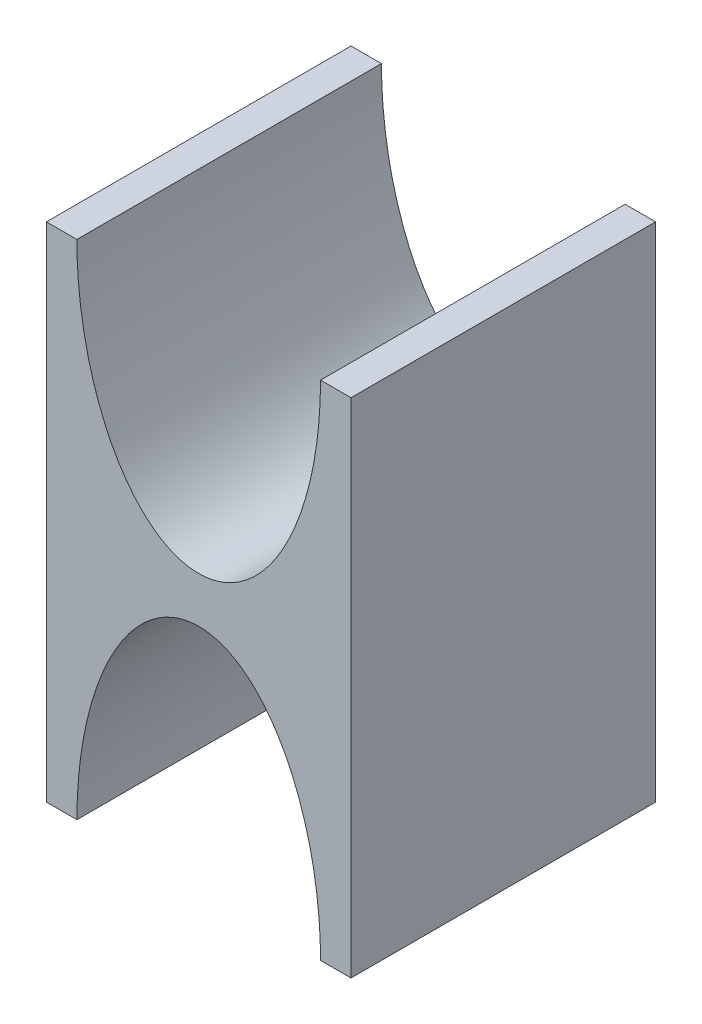
ISO-10303-21;
HEADER;
FILE_DESCRIPTION(('STEP AP214'),'2;1');
FILE_NAME('part.step','',(''),(''),'','','');
FILE_SCHEMA(('AUTOMOTIVE_DESIGN { 1 0 10303 214 1 1 1 1 }'));
ENDSEC;
DATA;
#1=APPLICATION_CONTEXT('core data for automotive mechanical design processes');
#2=APPLICATION_PROTOCOL_DEFINITION('international standard','automotive_design',2000,#1);
#3=PRODUCT_CONTEXT('',#1,'mechanical');
#4=PRODUCT('Part','Part','',(#3));
#5=PRODUCT_RELATED_PRODUCT_CATEGORY('part','',(#4));
#6=PRODUCT_DEFINITION_FORMATION('','',#4);
#7=PRODUCT_DEFINITION_CONTEXT('part definition',#1,'design');
#8=PRODUCT_DEFINITION('design','',#6,#7);
#9=PRODUCT_DEFINITION_SHAPE('','',#8);
#10=(LENGTH_UNIT() NAMED_UNIT(*) SI_UNIT(.MILLI.,.METRE.));
#11=(NAMED_UNIT(*) PLANE_ANGLE_UNIT() SI_UNIT($,.RADIAN.));
#12=(NAMED_UNIT(*) SI_UNIT($,.STERADIAN.) SOLID_ANGLE_UNIT());
#13=UNCERTAINTY_MEASURE_WITH_UNIT(LENGTH_MEASURE(1.E-05),#10,'distance_accuracy_value','');
#14=(GEOMETRIC_REPRESENTATION_CONTEXT(3) GLOBAL_UNCERTAINTY_ASSIGNED_CONTEXT((#13)) GLOBAL_UNIT_ASSIGNED_CONTEXT((#10,
#11,#12)) REPRESENTATION_CONTEXT('',''));
#15=CARTESIAN_POINT('',(0.,0.,0.));
#16=DIRECTION('',(0.,0.,1.));
#17=DIRECTION('',(1.,0.,0.));
#18=AXIS2_PLACEMENT_3D('',#15,#16,#17);
#19=CARTESIAN_POINT('',(-8.,-16.5,20.));
#20=DIRECTION('',(0.,1.,0.));
#21=DIRECTION('',(0.,0.,1.));
#22=AXIS2_PLACEMENT_3D('',#19,#20,#21);
#23=PLANE('',#22);
#24=DIRECTION('',(1.,0.,0.));
#25=VECTOR('',#24,1.);
#26=CARTESIAN_POINT('',(-8.,-16.5,0.));
#27=LINE('',#26,#25);
#28=CARTESIAN_POINT('',(-10.,-16.5,0.));
#29=VERTEX_POINT('',#28);
#30=CARTESIAN_POINT('',(-8.,-16.5,0.));
#31=VERTEX_POINT('',#30);
#32=EDGE_CURVE('E141',#29,#31,#27,.T.);
#33=ORIENTED_EDGE('',*,*,#32,.T.);
#34=DIRECTION('',(0.,0.,-1.));
#35=VECTOR('',#34,1.);
#36=CARTESIAN_POINT('',(-8.,-16.5,20.));
#37=LINE('',#36,#35);
#38=CARTESIAN_POINT('',(-8.,-16.5,20.));
#39=VERTEX_POINT('',#38);
#40=EDGE_CURVE('E12',#39,#31,#37,.T.);
#41=ORIENTED_EDGE('',*,*,#40,.F.);
#42=DIRECTION('',(1.,0.,0.));
#43=VECTOR('',#42,1.);
#44=CARTESIAN_POINT('',(-8.,-16.5,20.));
#45=LINE('',#44,#43);
#46=CARTESIAN_POINT('',(-10.,-16.5,20.));
#47=VERTEX_POINT('',#46);
#48=EDGE_CURVE('E156',#47,#39,#45,.T.);
#49=ORIENTED_EDGE('',*,*,#48,.F.);
#50=DIRECTION('',(0.,0.,-1.));
#51=VECTOR('',#50,1.);
#52=CARTESIAN_POINT('',(-10.,-16.5,20.));
#53=LINE('',#52,#51);
#54=EDGE_CURVE('E136',#47,#29,#53,.T.);
#55=ORIENTED_EDGE('',*,*,#54,.T.);
#56=EDGE_LOOP('',(#33,#41,#49,#55));
#57=FACE_BOUND('',#56,.T.);
#58=ADVANCED_FACE('F44',(#57),#23,.F.);
#59=CARTESIAN_POINT('',(0.,-16.5,20.));
#60=DIRECTION('',(0.,0.,-1.));
#61=DIRECTION('',(0.,1.,0.));
#62=AXIS2_PLACEMENT_3D('',#59,#60,#61);
#63=ELLIPSE('',#62,15.,8.);
#64=DIRECTION('',(0.,0.,-1.));
#65=VECTOR('',#64,1.);
#66=SURFACE_OF_LINEAR_EXTRUSION('',#63,#65);
#67=CARTESIAN_POINT('',(0.,-16.5,0.));
#68=DIRECTION('',(0.,0.,-1.));
#69=DIRECTION('',(0.,1.,0.));
#70=AXIS2_PLACEMENT_3D('',#67,#68,#69);
#71=ELLIPSE('',#70,15.,8.);
#72=CARTESIAN_POINT('',(8.,-16.5,0.));
#73=VERTEX_POINT('',#72);
#74=EDGE_CURVE('E144',#31,#73,#71,.T.);
#75=ORIENTED_EDGE('',*,*,#74,.T.);
#76=DIRECTION('',(0.,0.,-1.));
#77=VECTOR('',#76,1.);
#78=CARTESIAN_POINT('',(8.,-16.5,20.));
#79=LINE('',#78,#77);
#80=CARTESIAN_POINT('',(8.,-16.5,20.));
#81=VERTEX_POINT('',#80);
#82=EDGE_CURVE('E52',#81,#73,#79,.T.);
#83=ORIENTED_EDGE('',*,*,#82,.F.);
#84=EDGE_CURVE('E103',#39,#81,#63,.T.);
#85=ORIENTED_EDGE('',*,*,#84,.F.);
#86=ORIENTED_EDGE('',*,*,#40,.T.);
#87=EDGE_LOOP('',(#75,#83,#85,#86));
#88=FACE_BOUND('',#87,.T.);
#89=ADVANCED_FACE('F191',(#88),#66,.F.);
#90=CARTESIAN_POINT('',(8.,-16.5,20.));
#91=DIRECTION('',(0.,1.,0.));
#92=DIRECTION('',(0.,0.,1.));
#93=AXIS2_PLACEMENT_3D('',#90,#91,#92);
#94=PLANE('',#93);
#95=DIRECTION('',(1.,0.,0.));
#96=VECTOR('',#95,1.);
#97=CARTESIAN_POINT('',(8.,-16.5,0.));
#98=LINE('',#97,#96);
#99=CARTESIAN_POINT('',(10.,-16.5,0.));
#100=VERTEX_POINT('',#99);
#101=EDGE_CURVE('E146',#73,#100,#98,.T.);
#102=ORIENTED_EDGE('',*,*,#101,.T.);
#103=DIRECTION('',(0.,0.,-1.));
#104=VECTOR('',#103,1.);
#105=CARTESIAN_POINT('',(10.,-16.5,20.));
#106=LINE('',#105,#104);
#107=CARTESIAN_POINT('',(10.,-16.5,20.));
#108=VERTEX_POINT('',#107);
#109=EDGE_CURVE('E165',#108,#100,#106,.T.);
#110=ORIENTED_EDGE('',*,*,#109,.F.);
#111=DIRECTION('',(1.,0.,0.));
#112=VECTOR('',#111,1.);
#113=CARTESIAN_POINT('',(8.,-16.5,20.));
#114=LINE('',#113,#112);
#115=EDGE_CURVE('E173',#81,#108,#114,.T.);
#116=ORIENTED_EDGE('',*,*,#115,.F.);
#117=ORIENTED_EDGE('',*,*,#82,.T.);
#118=EDGE_LOOP('',(#102,#110,#116,#117));
#119=FACE_BOUND('',#118,.T.);
#120=ADVANCED_FACE('F171',(#119),#94,.F.);
#121=CARTESIAN_POINT('',(10.,16.5,20.));
#122=DIRECTION('',(-1.,0.,0.));
#123=DIRECTION('',(0.,-1.,0.));
#124=AXIS2_PLACEMENT_3D('',#121,#122,#123);
#125=PLANE('',#124);
#126=DIRECTION('',(0.,1.,0.));
#127=VECTOR('',#126,1.);
#128=CARTESIAN_POINT('',(10.,16.5,0.));
#129=LINE('',#128,#127);
#130=CARTESIAN_POINT('',(10.,16.5,0.));
#131=VERTEX_POINT('',#130);
#132=EDGE_CURVE('E147',#100,#131,#129,.T.);
#133=ORIENTED_EDGE('',*,*,#132,.T.);
#134=DIRECTION('',(0.,0.,-1.));
#135=VECTOR('',#134,1.);
#136=CARTESIAN_POINT('',(10.,16.5,20.));
#137=LINE('',#136,#135);
#138=CARTESIAN_POINT('',(10.,16.5,20.));
#139=VERTEX_POINT('',#138);
#140=EDGE_CURVE('E162',#139,#131,#137,.T.);
#141=ORIENTED_EDGE('',*,*,#140,.F.);
#142=DIRECTION('',(0.,1.,0.));
#143=VECTOR('',#142,1.);
#144=CARTESIAN_POINT('',(10.,16.5,20.));
#145=LINE('',#144,#143);
#146=EDGE_CURVE('E185',#108,#139,#145,.T.);
#147=ORIENTED_EDGE('',*,*,#146,.F.);
#148=ORIENTED_EDGE('',*,*,#109,.T.);
#149=EDGE_LOOP('',(#133,#141,#147,#148));
#150=FACE_BOUND('',#149,.T.);
#151=ADVANCED_FACE('F181',(#150),#125,.F.);
#152=CARTESIAN_POINT('',(8.,16.5,20.));
#153=DIRECTION('',(0.,-1.,0.));
#154=DIRECTION('',(0.,0.,-1.));
#155=AXIS2_PLACEMENT_3D('',#152,#153,#154);
#156=PLANE('',#155);
#157=DIRECTION('',(-1.,0.,0.));
#158=VECTOR('',#157,1.);
#159=CARTESIAN_POINT('',(8.,16.5,0.));
#160=LINE('',#159,#158);
#161=CARTESIAN_POINT('',(8.,16.5,0.));
#162=VERTEX_POINT('',#161);
#163=EDGE_CURVE('E151',#131,#162,#160,.T.);
#164=ORIENTED_EDGE('',*,*,#163,.T.);
#165=DIRECTION('',(0.,0.,-1.));
#166=VECTOR('',#165,1.);
#167=CARTESIAN_POINT('',(8.,16.5,20.));
#168=LINE('',#167,#166);
#169=CARTESIAN_POINT('',(8.,16.5,20.));
#170=VERTEX_POINT('',#169);
#171=EDGE_CURVE('E131',#170,#162,#168,.T.);
#172=ORIENTED_EDGE('',*,*,#171,.F.);
#173=DIRECTION('',(-1.,0.,0.));
#174=VECTOR('',#173,1.);
#175=CARTESIAN_POINT('',(8.,16.5,20.));
#176=LINE('',#175,#174);
#177=EDGE_CURVE('E122',#139,#170,#176,.T.);
#178=ORIENTED_EDGE('',*,*,#177,.F.);
#179=ORIENTED_EDGE('',*,*,#140,.T.);
#180=EDGE_LOOP('',(#164,#172,#178,#179));
#181=FACE_BOUND('',#180,.T.);
#182=ADVANCED_FACE('F184',(#181),#156,.F.);
#183=CARTESIAN_POINT('',(0.,16.5,20.));
#184=DIRECTION('',(0.,0.,-1.));
#185=DIRECTION('',(0.,-1.,0.));
#186=AXIS2_PLACEMENT_3D('',#183,#184,#185);
#187=ELLIPSE('',#186,15.,8.);
#188=DIRECTION('',(0.,0.,-1.));
#189=VECTOR('',#188,1.);
#190=SURFACE_OF_LINEAR_EXTRUSION('',#187,#189);
#191=CARTESIAN_POINT('',(0.,16.5,0.));
#192=DIRECTION('',(0.,0.,-1.));
#193=DIRECTION('',(0.,-1.,0.));
#194=AXIS2_PLACEMENT_3D('',#191,#192,#193);
#195=ELLIPSE('',#194,15.,8.);
#196=CARTESIAN_POINT('',(-8.,16.5,0.));
#197=VERTEX_POINT('',#196);
#198=EDGE_CURVE('E130',#162,#197,#195,.T.);
#199=ORIENTED_EDGE('',*,*,#198,.T.);
#200=DIRECTION('',(0.,0.,-1.));
#201=VECTOR('',#200,1.);
#202=CARTESIAN_POINT('',(-8.,16.5,20.));
#203=LINE('',#202,#201);
#204=CARTESIAN_POINT('',(-8.,16.5,20.));
#205=VERTEX_POINT('',#204);
#206=EDGE_CURVE('E127',#205,#197,#203,.T.);
#207=ORIENTED_EDGE('',*,*,#206,.F.);
#208=EDGE_CURVE('E116',#170,#205,#187,.T.);
#209=ORIENTED_EDGE('',*,*,#208,.F.);
#210=ORIENTED_EDGE('',*,*,#171,.T.);
#211=EDGE_LOOP('',(#199,#207,#209,#210));
#212=FACE_BOUND('',#211,.T.);
#213=ADVANCED_FACE('F128',(#212),#190,.F.);
#214=CARTESIAN_POINT('',(-8.,16.5,20.));
#215=DIRECTION('',(0.,-1.,0.));
#216=DIRECTION('',(0.,0.,-1.));
#217=AXIS2_PLACEMENT_3D('',#214,#215,#216);
#218=PLANE('',#217);
#219=DIRECTION('',(-1.,0.,0.));
#220=VECTOR('',#219,1.);
#221=CARTESIAN_POINT('',(-8.,16.5,0.));
#222=LINE('',#221,#220);
#223=CARTESIAN_POINT('',(-10.,16.5,0.));
#224=VERTEX_POINT('',#223);
#225=EDGE_CURVE('E89',#197,#224,#222,.T.);
#226=ORIENTED_EDGE('',*,*,#225,.T.);
#227=DIRECTION('',(0.,0.,-1.));
#228=VECTOR('',#227,1.);
#229=CARTESIAN_POINT('',(-10.,16.5,20.));
#230=LINE('',#229,#228);
#231=CARTESIAN_POINT('',(-10.,16.5,20.));
#232=VERTEX_POINT('',#231);
#233=EDGE_CURVE('E132',#232,#224,#230,.T.);
#234=ORIENTED_EDGE('',*,*,#233,.F.);
#235=DIRECTION('',(-1.,0.,0.));
#236=VECTOR('',#235,1.);
#237=CARTESIAN_POINT('',(-8.,16.5,20.));
#238=LINE('',#237,#236);
#239=EDGE_CURVE('E120',#205,#232,#238,.T.);
#240=ORIENTED_EDGE('',*,*,#239,.F.);
#241=ORIENTED_EDGE('',*,*,#206,.T.);
#242=EDGE_LOOP('',(#226,#234,#240,#241));
#243=FACE_BOUND('',#242,.T.);
#244=ADVANCED_FACE('F134',(#243),#218,.F.);
#245=CARTESIAN_POINT('',(-10.,16.5,20.));
#246=DIRECTION('',(1.,0.,0.));
#247=DIRECTION('',(0.,1.,0.));
#248=AXIS2_PLACEMENT_3D('',#245,#246,#247);
#249=PLANE('',#248);
#250=DIRECTION('',(0.,-1.,0.));
#251=VECTOR('',#250,1.);
#252=CARTESIAN_POINT('',(-10.,16.5,0.));
#253=LINE('',#252,#251);
#254=EDGE_CURVE('E95',#224,#29,#253,.T.);
#255=ORIENTED_EDGE('',*,*,#254,.T.);
#256=ORIENTED_EDGE('',*,*,#54,.F.);
#257=DIRECTION('',(0.,-1.,0.));
#258=VECTOR('',#257,1.);
#259=CARTESIAN_POINT('',(-10.,16.5,20.));
#260=LINE('',#259,#258);
#261=EDGE_CURVE('E60',#232,#47,#260,.T.);
#262=ORIENTED_EDGE('',*,*,#261,.F.);
#263=ORIENTED_EDGE('',*,*,#233,.T.);
#264=EDGE_LOOP('',(#255,#256,#262,#263));
#265=FACE_BOUND('',#264,.T.);
#266=ADVANCED_FACE('F204',(#265),#249,.F.);
#267=CARTESIAN_POINT('',(0.,16.5,20.));
#268=DIRECTION('',(0.,0.,-1.));
#269=DIRECTION('',(-1.,0.,0.));
#270=AXIS2_PLACEMENT_3D('',#267,#268,#269);
#271=PLANE('',#270);
#272=ORIENTED_EDGE('',*,*,#48,.T.);
#273=ORIENTED_EDGE('',*,*,#84,.T.);
#274=ORIENTED_EDGE('',*,*,#115,.T.);
#275=ORIENTED_EDGE('',*,*,#146,.T.);
#276=ORIENTED_EDGE('',*,*,#177,.T.);
#277=ORIENTED_EDGE('',*,*,#208,.T.);
#278=ORIENTED_EDGE('',*,*,#239,.T.);
#279=ORIENTED_EDGE('',*,*,#261,.T.);
#280=EDGE_LOOP('',(#272,#273,#274,#275,#276,#277,#278,#279));
#281=FACE_BOUND('',#280,.T.);
#282=ADVANCED_FACE('F118',(#281),#271,.F.);
#283=CARTESIAN_POINT('',(0.,16.5,0.));
#284=DIRECTION('',(0.,0.,-1.));
#285=DIRECTION('',(-1.,0.,0.));
#286=AXIS2_PLACEMENT_3D('',#283,#284,#285);
#287=PLANE('',#286);
#288=ORIENTED_EDGE('',*,*,#32,.F.);
#289=ORIENTED_EDGE('',*,*,#254,.F.);
#290=ORIENTED_EDGE('',*,*,#225,.F.);
#291=ORIENTED_EDGE('',*,*,#198,.F.);
#292=ORIENTED_EDGE('',*,*,#163,.F.);
#293=ORIENTED_EDGE('',*,*,#132,.F.);
#294=ORIENTED_EDGE('',*,*,#101,.F.);
#295=ORIENTED_EDGE('',*,*,#74,.F.);
#296=EDGE_LOOP('',(#288,#289,#290,#291,#292,#293,#294,#295));
#297=FACE_BOUND('',#296,.T.);
#298=ADVANCED_FACE('F177',(#297),#287,.T.);
#299=CLOSED_SHELL('',(#58,#89,#120,#151,#182,#213,#244,#266,#282,#298));
#300=MANIFOLD_SOLID_BREP('B2',#299);
#301=ADVANCED_BREP_SHAPE_REPRESENTATION('',(#18,#300),#14);
#302=SHAPE_DEFINITION_REPRESENTATION(#9,#301);
ENDSEC;
END-ISO-10303-21;
